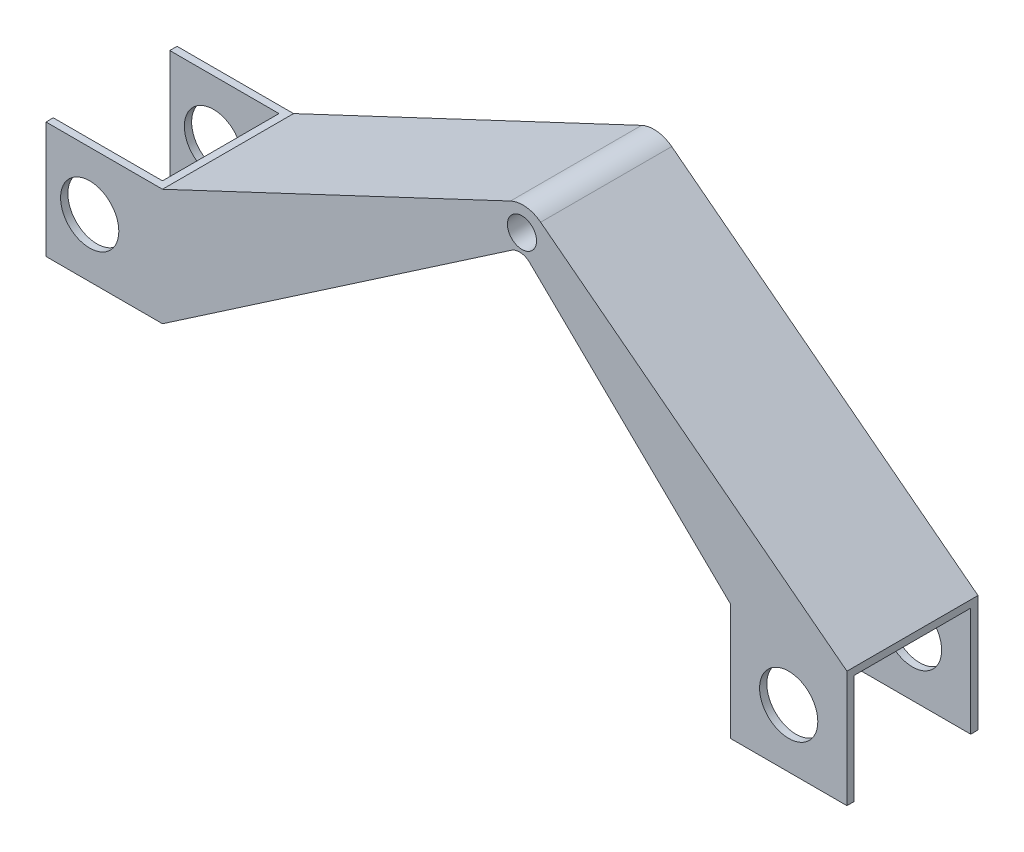
ISO-10303-21;
HEADER;
FILE_DESCRIPTION(('STEP AP214'),'2;1');
FILE_NAME('part.step','',(''),(''),'','','');
FILE_SCHEMA(('AUTOMOTIVE_DESIGN { 1 0 10303 214 1 1 1 1 }'));
ENDSEC;
DATA;
#1=APPLICATION_CONTEXT('core data for automotive mechanical design processes');
#2=APPLICATION_PROTOCOL_DEFINITION('international standard','automotive_design',2000,#1);
#3=PRODUCT_CONTEXT('',#1,'mechanical');
#4=PRODUCT('Part','Part','',(#3));
#5=PRODUCT_RELATED_PRODUCT_CATEGORY('part','',(#4));
#6=PRODUCT_DEFINITION_FORMATION('','',#4);
#7=PRODUCT_DEFINITION_CONTEXT('part definition',#1,'design');
#8=PRODUCT_DEFINITION('design','',#6,#7);
#9=PRODUCT_DEFINITION_SHAPE('','',#8);
#10=(LENGTH_UNIT() NAMED_UNIT(*) SI_UNIT(.MILLI.,.METRE.));
#11=(NAMED_UNIT(*) PLANE_ANGLE_UNIT() SI_UNIT($,.RADIAN.));
#12=(NAMED_UNIT(*) SI_UNIT($,.STERADIAN.) SOLID_ANGLE_UNIT());
#13=UNCERTAINTY_MEASURE_WITH_UNIT(LENGTH_MEASURE(1.E-05),#10,'distance_accuracy_value','');
#14=(GEOMETRIC_REPRESENTATION_CONTEXT(3) GLOBAL_UNCERTAINTY_ASSIGNED_CONTEXT((#13)) GLOBAL_UNIT_ASSIGNED_CONTEXT((#10,
#11,#12)) REPRESENTATION_CONTEXT('',''));
#15=CARTESIAN_POINT('',(0.,0.,0.));
#16=DIRECTION('',(0.,0.,1.));
#17=DIRECTION('',(1.,0.,0.));
#18=AXIS2_PLACEMENT_3D('',#15,#16,#17);
#19=CARTESIAN_POINT('',(1092.2,-232.664807141011,228.6));
#20=DIRECTION('',(0.,1.,0.));
#21=DIRECTION('',(0.,0.,1.));
#22=AXIS2_PLACEMENT_3D('',#19,#20,#21);
#23=PLANE('',#22);
#24=DIRECTION('',(0.,0.,-1.));
#25=VECTOR('',#24,1.);
#26=CARTESIAN_POINT('',(1295.4,-232.664807141011,228.6));
#27=LINE('',#26,#25);
#28=CARTESIAN_POINT('',(1295.4,-232.664807141011,12.7));
#29=VERTEX_POINT('',#28);
#30=CARTESIAN_POINT('',(1295.4,-232.664807141011,0.));
#31=VERTEX_POINT('',#30);
#32=EDGE_CURVE('E252',#29,#31,#27,.T.);
#33=ORIENTED_EDGE('',*,*,#32,.F.);
#34=DIRECTION('',(-1.,0.,0.));
#35=VECTOR('',#34,1.);
#36=CARTESIAN_POINT('',(1092.2,-232.664807141011,12.7));
#37=LINE('',#36,#35);
#38=CARTESIAN_POINT('',(1092.2,-232.664807141011,12.7));
#39=VERTEX_POINT('',#38);
#40=EDGE_CURVE('E183',#29,#39,#37,.T.);
#41=ORIENTED_EDGE('',*,*,#40,.T.);
#42=DIRECTION('',(0.,0.,-1.));
#43=VECTOR('',#42,1.);
#44=CARTESIAN_POINT('',(1092.2,-232.664807141011,228.6));
#45=LINE('',#44,#43);
#46=CARTESIAN_POINT('',(1092.2,-232.664807141011,0.));
#47=VERTEX_POINT('',#46);
#48=EDGE_CURVE('E255',#39,#47,#45,.T.);
#49=ORIENTED_EDGE('',*,*,#48,.T.);
#50=DIRECTION('',(1.,0.,0.));
#51=VECTOR('',#50,1.);
#52=CARTESIAN_POINT('',(1092.2,-232.664807141011,0.));
#53=LINE('',#52,#51);
#54=EDGE_CURVE('E233',#47,#31,#53,.T.);
#55=ORIENTED_EDGE('',*,*,#54,.T.);
#56=EDGE_LOOP('',(#33,#41,#49,#55));
#57=FACE_BOUND('',#56,.T.);
#58=ADVANCED_FACE('F32',(#57),#23,.F.);
#59=CARTESIAN_POINT('',(-101.6,-101.6,228.6));
#60=DIRECTION('',(1.,0.,0.));
#61=DIRECTION('',(0.,0.,-1.));
#62=AXIS2_PLACEMENT_3D('',#59,#60,#61);
#63=PLANE('',#62);
#64=DIRECTION('',(0.,0.,-1.));
#65=VECTOR('',#64,1.);
#66=CARTESIAN_POINT('',(-101.6,-101.6,228.6));
#67=LINE('',#66,#65);
#68=CARTESIAN_POINT('',(-101.6,-101.6,12.7));
#69=VERTEX_POINT('',#68);
#70=CARTESIAN_POINT('',(-101.6,-101.6,0.));
#71=VERTEX_POINT('',#70);
#72=EDGE_CURVE('E311',#69,#71,#67,.T.);
#73=ORIENTED_EDGE('',*,*,#72,.F.);
#74=DIRECTION('',(0.,1.,0.));
#75=VECTOR('',#74,1.);
#76=CARTESIAN_POINT('',(-101.6,-101.6,12.7));
#77=LINE('',#76,#75);
#78=CARTESIAN_POINT('',(-101.6,101.6,12.7));
#79=VERTEX_POINT('',#78);
#80=EDGE_CURVE('E291',#69,#79,#77,.T.);
#81=ORIENTED_EDGE('',*,*,#80,.T.);
#82=DIRECTION('',(0.,0.,-1.));
#83=VECTOR('',#82,1.);
#84=CARTESIAN_POINT('',(-101.6,101.6,228.6));
#85=LINE('',#84,#83);
#86=CARTESIAN_POINT('',(-101.6,101.6,0.));
#87=VERTEX_POINT('',#86);
#88=EDGE_CURVE('E315',#79,#87,#85,.T.);
#89=ORIENTED_EDGE('',*,*,#88,.T.);
#90=DIRECTION('',(0.,-1.,0.));
#91=VECTOR('',#90,1.);
#92=CARTESIAN_POINT('',(-101.6,-101.6,0.));
#93=LINE('',#92,#91);
#94=EDGE_CURVE('E305',#87,#71,#93,.T.);
#95=ORIENTED_EDGE('',*,*,#94,.T.);
#96=EDGE_LOOP('',(#73,#81,#89,#95));
#97=FACE_BOUND('',#96,.T.);
#98=ADVANCED_FACE('F351',(#97),#63,.F.);
#99=CARTESIAN_POINT('',(-101.6,101.6,228.6));
#100=DIRECTION('',(0.,-1.,0.));
#101=DIRECTION('',(0.,0.,-1.));
#102=AXIS2_PLACEMENT_3D('',#99,#100,#101);
#103=PLANE('',#102);
#104=ORIENTED_EDGE('',*,*,#88,.F.);
#105=DIRECTION('',(-1.,0.,0.));
#106=VECTOR('',#105,1.);
#107=CARTESIAN_POINT('',(-88.9,101.6,12.7));
#108=LINE('',#107,#106);
#109=CARTESIAN_POINT('',(88.9,101.6,12.7));
#110=VERTEX_POINT('',#109);
#111=EDGE_CURVE('E283',#110,#79,#108,.T.);
#112=ORIENTED_EDGE('',*,*,#111,.F.);
#113=DIRECTION('',(0.,0.,-1.));
#114=VECTOR('',#113,1.);
#115=CARTESIAN_POINT('',(88.9,101.6,215.9));
#116=LINE('',#115,#114);
#117=CARTESIAN_POINT('',(88.9,101.6,215.9));
#118=VERTEX_POINT('',#117);
#119=EDGE_CURVE('E280',#118,#110,#116,.T.);
#120=ORIENTED_EDGE('',*,*,#119,.F.);
#121=DIRECTION('',(1.,0.,0.));
#122=VECTOR('',#121,1.);
#123=CARTESIAN_POINT('',(-88.9,101.6,215.9));
#124=LINE('',#123,#122);
#125=CARTESIAN_POINT('',(-101.6,101.6,215.9));
#126=VERTEX_POINT('',#125);
#127=EDGE_CURVE('E278',#126,#118,#124,.T.);
#128=ORIENTED_EDGE('',*,*,#127,.F.);
#129=CARTESIAN_POINT('',(-101.6,101.6,228.6));
#130=VERTEX_POINT('',#129);
#131=EDGE_CURVE('E316',#130,#126,#85,.T.);
#132=ORIENTED_EDGE('',*,*,#131,.F.);
#133=DIRECTION('',(-1.,0.,0.));
#134=VECTOR('',#133,1.);
#135=CARTESIAN_POINT('',(-101.6,101.6,228.6));
#136=LINE('',#135,#134);
#137=CARTESIAN_POINT('',(101.6,101.6,228.6));
#138=VERTEX_POINT('',#137);
#139=EDGE_CURVE('E295',#138,#130,#136,.T.);
#140=ORIENTED_EDGE('',*,*,#139,.F.);
#141=DIRECTION('',(0.,0.,-1.));
#142=VECTOR('',#141,1.);
#143=CARTESIAN_POINT('',(101.6,101.6,228.6));
#144=LINE('',#143,#142);
#145=CARTESIAN_POINT('',(101.6,101.6,0.));
#146=VERTEX_POINT('',#145);
#147=EDGE_CURVE('E319',#138,#146,#144,.T.);
#148=ORIENTED_EDGE('',*,*,#147,.T.);
#149=DIRECTION('',(-1.,0.,0.));
#150=VECTOR('',#149,1.);
#151=CARTESIAN_POINT('',(-101.6,101.6,0.));
#152=LINE('',#151,#150);
#153=EDGE_CURVE('E294',#146,#87,#152,.T.);
#154=ORIENTED_EDGE('',*,*,#153,.T.);
#155=EDGE_LOOP('',(#104,#112,#120,#128,#132,#140,#148,#154));
#156=FACE_BOUND('',#155,.T.);
#157=ADVANCED_FACE('F34',(#156),#103,.F.);
#158=ORIENTED_EDGE('',*,*,#131,.T.);
#159=DIRECTION('',(0.,-1.,0.));
#160=VECTOR('',#159,1.);
#161=CARTESIAN_POINT('',(-101.6,-101.6,215.9));
#162=LINE('',#161,#160);
#163=CARTESIAN_POINT('',(-101.6,-101.6,215.9));
#164=VERTEX_POINT('',#163);
#165=EDGE_CURVE('E287',#126,#164,#162,.T.);
#166=ORIENTED_EDGE('',*,*,#165,.T.);
#167=CARTESIAN_POINT('',(-101.6,-101.6,228.6));
#168=VERTEX_POINT('',#167);
#169=EDGE_CURVE('E312',#168,#164,#67,.T.);
#170=ORIENTED_EDGE('',*,*,#169,.F.);
#171=DIRECTION('',(0.,-1.,0.));
#172=VECTOR('',#171,1.);
#173=CARTESIAN_POINT('',(-101.6,-101.6,228.6));
#174=LINE('',#173,#172);
#175=EDGE_CURVE('E297',#130,#168,#174,.T.);
#176=ORIENTED_EDGE('',*,*,#175,.F.);
#177=EDGE_LOOP('',(#158,#166,#170,#176));
#178=FACE_BOUND('',#177,.T.);
#179=ADVANCED_FACE('F359',(#178),#63,.F.);
#180=CARTESIAN_POINT('',(-101.6,-101.6,228.6));
#181=DIRECTION('',(0.,1.,0.));
#182=DIRECTION('',(0.,0.,1.));
#183=AXIS2_PLACEMENT_3D('',#180,#181,#182);
#184=PLANE('',#183);
#185=DIRECTION('',(0.,0.,-1.));
#186=VECTOR('',#185,1.);
#187=CARTESIAN_POINT('',(88.9,-101.6,228.6));
#188=LINE('',#187,#186);
#189=CARTESIAN_POINT('',(88.9,-101.6,215.9));
#190=VERTEX_POINT('',#189);
#191=CARTESIAN_POINT('',(88.9,-101.6,12.7));
#192=VERTEX_POINT('',#191);
#193=EDGE_CURVE('E325',#190,#192,#188,.T.);
#194=ORIENTED_EDGE('',*,*,#193,.T.);
#195=DIRECTION('',(-1.,0.,0.));
#196=VECTOR('',#195,1.);
#197=CARTESIAN_POINT('',(-101.6,-101.6,12.7));
#198=LINE('',#197,#196);
#199=EDGE_CURVE('E41',#192,#69,#198,.T.);
#200=ORIENTED_EDGE('',*,*,#199,.T.);
#201=ORIENTED_EDGE('',*,*,#72,.T.);
#202=DIRECTION('',(1.,0.,0.));
#203=VECTOR('',#202,1.);
#204=CARTESIAN_POINT('',(-101.6,-101.6,0.));
#205=LINE('',#204,#203);
#206=CARTESIAN_POINT('',(101.6,-101.6,0.));
#207=VERTEX_POINT('',#206);
#208=EDGE_CURVE('E298',#71,#207,#205,.T.);
#209=ORIENTED_EDGE('',*,*,#208,.T.);
#210=DIRECTION('',(0.,0.,-1.));
#211=VECTOR('',#210,1.);
#212=CARTESIAN_POINT('',(101.6,-101.6,228.6));
#213=LINE('',#212,#211);
#214=CARTESIAN_POINT('',(101.6,-101.6,228.6));
#215=VERTEX_POINT('',#214);
#216=EDGE_CURVE('E302',#215,#207,#213,.T.);
#217=ORIENTED_EDGE('',*,*,#216,.F.);
#218=DIRECTION('',(1.,0.,0.));
#219=VECTOR('',#218,1.);
#220=CARTESIAN_POINT('',(-101.6,-101.6,228.6));
#221=LINE('',#220,#219);
#222=EDGE_CURVE('E300',#168,#215,#221,.T.);
#223=ORIENTED_EDGE('',*,*,#222,.F.);
#224=ORIENTED_EDGE('',*,*,#169,.T.);
#225=DIRECTION('',(1.,0.,0.));
#226=VECTOR('',#225,1.);
#227=CARTESIAN_POINT('',(-101.6,-101.6,215.9));
#228=LINE('',#227,#226);
#229=EDGE_CURVE('E322',#164,#190,#228,.T.);
#230=ORIENTED_EDGE('',*,*,#229,.T.);
#231=EDGE_LOOP('',(#194,#200,#201,#209,#217,#223,#224,#230));
#232=FACE_BOUND('',#231,.T.);
#233=ADVANCED_FACE('F442',(#232),#184,.F.);
#234=CARTESIAN_POINT('',(0.,0.,228.6));
#235=DIRECTION('',(0.,0.,-1.));
#236=DIRECTION('',(-1.,0.,0.));
#237=AXIS2_PLACEMENT_3D('',#234,#235,#236);
#238=PLANE('',#237);
#239=CARTESIAN_POINT('',(728.615646144925,349.569241459153,228.6));
#240=DIRECTION('',(0.,0.,1.));
#241=DIRECTION('',(1.,0.,0.));
#242=AXIS2_PLACEMENT_3D('',#239,#240,#241);
#243=CIRCLE('',#242,25.4);
#244=CARTESIAN_POINT('',(754.015646144925,349.569241459153,228.6));
#245=VERTEX_POINT('',#244);
#246=EDGE_CURVE('E621',#245,#245,#243,.T.);
#247=ORIENTED_EDGE('',*,*,#246,.F.);
#248=EDGE_LOOP('',(#247));
#249=FACE_BOUND('',#248,.T.);
#250=CARTESIAN_POINT('',(1193.8,-131.064807141011,228.6));
#251=DIRECTION('',(0.,0.,1.));
#252=DIRECTION('',(1.,0.,0.));
#253=AXIS2_PLACEMENT_3D('',#250,#251,#252);
#254=CIRCLE('',#253,50.8);
#255=CARTESIAN_POINT('',(1244.6,-131.064807141011,228.6));
#256=VERTEX_POINT('',#255);
#257=EDGE_CURVE('E623',#256,#256,#254,.T.);
#258=ORIENTED_EDGE('',*,*,#257,.F.);
#259=EDGE_LOOP('',(#258));
#260=FACE_BOUND('',#259,.T.);
#261=CARTESIAN_POINT('',(-25.4,0.,228.6));
#262=DIRECTION('',(0.,0.,1.));
#263=DIRECTION('',(1.,0.,0.));
#264=AXIS2_PLACEMENT_3D('',#261,#262,#263);
#265=CIRCLE('',#264,50.8);
#266=CARTESIAN_POINT('',(25.4,0.,228.6));
#267=VERTEX_POINT('',#266);
#268=EDGE_CURVE('E268',#267,#267,#265,.T.);
#269=ORIENTED_EDGE('',*,*,#268,.F.);
#270=EDGE_LOOP('',(#269));
#271=FACE_BOUND('',#270,.T.);
#272=ORIENTED_EDGE('',*,*,#222,.T.);
#273=DIRECTION('',(0.825979060801124,0.563700799288145,0.));
#274=VECTOR('',#273,1.);
#275=CARTESIAN_POINT('',(101.6,-101.6,228.6));
#276=LINE('',#275,#274);
#277=CARTESIAN_POINT('',(710.108636303215,313.68510943748,228.6));
#278=VERTEX_POINT('',#277);
#279=EDGE_CURVE('E204',#215,#278,#276,.T.);
#280=ORIENTED_EDGE('',*,*,#279,.T.);
#281=CARTESIAN_POINT('',(724.426636605134,292.705241293131,228.6));
#282=DIRECTION('',(0.,0.,-1.));
#283=DIRECTION('',(-1.,0.,0.));
#284=AXIS2_PLACEMENT_3D('',#281,#282,#283);
#285=CIRCLE('',#284,25.4);
#286=CARTESIAN_POINT('',(742.133450582767,310.915917797905,228.6));
#287=VERTEX_POINT('',#286);
#288=EDGE_CURVE('E206',#278,#287,#285,.T.);
#289=ORIENTED_EDGE('',*,*,#288,.T.);
#290=DIRECTION('',(0.716955767904459,-0.697118660536732,0.));
#291=VECTOR('',#290,1.);
#292=CARTESIAN_POINT('',(742.133450582767,310.915917797905,228.6));
#293=LINE('',#292,#291);
#294=CARTESIAN_POINT('',(1092.2,-29.4648071410109,228.6));
#295=VERTEX_POINT('',#294);
#296=EDGE_CURVE('E209',#287,#295,#293,.T.);
#297=ORIENTED_EDGE('',*,*,#296,.T.);
#298=DIRECTION('',(0.,-1.,0.));
#299=VECTOR('',#298,1.);
#300=CARTESIAN_POINT('',(1092.2,-29.4648071410109,228.6));
#301=LINE('',#300,#299);
#302=CARTESIAN_POINT('',(1092.2,-232.664807141011,228.6));
#303=VERTEX_POINT('',#302);
#304=EDGE_CURVE('E211',#295,#303,#301,.T.);
#305=ORIENTED_EDGE('',*,*,#304,.T.);
#306=DIRECTION('',(1.,0.,0.));
#307=VECTOR('',#306,1.);
#308=CARTESIAN_POINT('',(1092.2,-232.664807141011,228.6));
#309=LINE('',#308,#307);
#310=CARTESIAN_POINT('',(1295.4,-232.664807141011,228.6));
#311=VERTEX_POINT('',#310);
#312=EDGE_CURVE('E213',#303,#311,#309,.T.);
#313=ORIENTED_EDGE('',*,*,#312,.T.);
#314=DIRECTION('',(0.,1.,0.));
#315=VECTOR('',#314,1.);
#316=CARTESIAN_POINT('',(1295.4,-232.664807141011,228.6));
#317=LINE('',#316,#315);
#318=CARTESIAN_POINT('',(1295.4,-29.4648071410109,228.6));
#319=VERTEX_POINT('',#318);
#320=EDGE_CURVE('E215',#311,#319,#317,.T.);
#321=ORIENTED_EDGE('',*,*,#320,.T.);
#322=DIRECTION('',(-0.792554656782893,0.609800882265475,0.));
#323=VECTOR('',#322,1.);
#324=CARTESIAN_POINT('',(761.166531665849,381.580711975977,228.6));
#325=LINE('',#324,#323);
#326=CARTESIAN_POINT('',(761.166531665849,381.580711975977,228.6));
#327=VERTEX_POINT('',#326);
#328=EDGE_CURVE('E217',#319,#327,#325,.T.);
#329=ORIENTED_EDGE('',*,*,#328,.T.);
#330=CARTESIAN_POINT('',(730.188646846763,341.318935411406,228.6));
#331=DIRECTION('',(0.,0.,1.));
#332=DIRECTION('',(-1.,0.,0.));
#333=AXIS2_PLACEMENT_3D('',#330,#331,#332);
#334=CIRCLE('',#333,50.7999999999999);
#335=CARTESIAN_POINT('',(708.554663442672,387.282081105228,228.6));
#336=VERTEX_POINT('',#335);
#337=EDGE_CURVE('E219',#327,#336,#334,.T.);
#338=ORIENTED_EDGE('',*,*,#337,.T.);
#339=DIRECTION('',(-0.904786332555559,-0.425865815041148,0.));
#340=VECTOR('',#339,1.);
#341=CARTESIAN_POINT('',(101.6,101.6,228.6));
#342=LINE('',#341,#340);
#343=EDGE_CURVE('E221',#336,#138,#342,.T.);
#344=ORIENTED_EDGE('',*,*,#343,.T.);
#345=ORIENTED_EDGE('',*,*,#139,.T.);
#346=ORIENTED_EDGE('',*,*,#175,.T.);
#347=EDGE_LOOP('',(#272,#280,#289,#297,#305,#313,#321,#329,#338,#344,#345,#346));
#348=FACE_BOUND('',#347,.T.);
#349=ADVANCED_FACE('F420',(#249,#260,#271,#348),#238,.F.);
#350=CARTESIAN_POINT('',(0.,0.,0.));
#351=DIRECTION('',(0.,0.,-1.));
#352=DIRECTION('',(-1.,0.,0.));
#353=AXIS2_PLACEMENT_3D('',#350,#351,#352);
#354=PLANE('',#353);
#355=CARTESIAN_POINT('',(728.615646144925,349.569241459153,0.));
#356=DIRECTION('',(0.,0.,1.));
#357=DIRECTION('',(1.,0.,0.));
#358=AXIS2_PLACEMENT_3D('',#355,#356,#357);
#359=CIRCLE('',#358,25.4);
#360=CARTESIAN_POINT('',(754.015646144925,349.569241459153,0.));
#361=VERTEX_POINT('',#360);
#362=EDGE_CURVE('E618',#361,#361,#359,.T.);
#363=ORIENTED_EDGE('',*,*,#362,.T.);
#364=EDGE_LOOP('',(#363));
#365=FACE_BOUND('',#364,.T.);
#366=CARTESIAN_POINT('',(1193.8,-131.064807141011,0.));
#367=DIRECTION('',(0.,0.,1.));
#368=DIRECTION('',(1.,0.,0.));
#369=AXIS2_PLACEMENT_3D('',#366,#367,#368);
#370=CIRCLE('',#369,50.8);
#371=CARTESIAN_POINT('',(1244.6,-131.064807141011,0.));
#372=VERTEX_POINT('',#371);
#373=EDGE_CURVE('E626',#372,#372,#370,.T.);
#374=ORIENTED_EDGE('',*,*,#373,.T.);
#375=EDGE_LOOP('',(#374));
#376=FACE_BOUND('',#375,.T.);
#377=CARTESIAN_POINT('',(-25.4,0.,0.));
#378=DIRECTION('',(0.,0.,1.));
#379=DIRECTION('',(1.,0.,0.));
#380=AXIS2_PLACEMENT_3D('',#377,#378,#379);
#381=CIRCLE('',#380,50.8);
#382=CARTESIAN_POINT('',(25.4,0.,0.));
#383=VERTEX_POINT('',#382);
#384=EDGE_CURVE('E269',#383,#383,#381,.T.);
#385=ORIENTED_EDGE('',*,*,#384,.T.);
#386=EDGE_LOOP('',(#385));
#387=FACE_BOUND('',#386,.T.);
#388=ORIENTED_EDGE('',*,*,#153,.F.);
#389=DIRECTION('',(-0.904786332555559,-0.425865815041148,0.));
#390=VECTOR('',#389,1.);
#391=CARTESIAN_POINT('',(101.6,101.6,0.));
#392=LINE('',#391,#390);
#393=CARTESIAN_POINT('',(708.554663442672,387.282081105228,0.));
#394=VERTEX_POINT('',#393);
#395=EDGE_CURVE('E207',#394,#146,#392,.T.);
#396=ORIENTED_EDGE('',*,*,#395,.F.);
#397=CARTESIAN_POINT('',(730.188646846763,341.318935411406,0.));
#398=DIRECTION('',(0.,0.,1.));
#399=DIRECTION('',(-1.,0.,0.));
#400=AXIS2_PLACEMENT_3D('',#397,#398,#399);
#401=CIRCLE('',#400,50.7999999999999);
#402=CARTESIAN_POINT('',(761.166531665849,381.580711975977,0.));
#403=VERTEX_POINT('',#402);
#404=EDGE_CURVE('E240',#403,#394,#401,.T.);
#405=ORIENTED_EDGE('',*,*,#404,.F.);
#406=DIRECTION('',(-0.792554656782893,0.609800882265475,0.));
#407=VECTOR('',#406,1.);
#408=CARTESIAN_POINT('',(761.166531665849,381.580711975977,0.));
#409=LINE('',#408,#407);
#410=CARTESIAN_POINT('',(1295.4,-29.4648071410109,0.));
#411=VERTEX_POINT('',#410);
#412=EDGE_CURVE('E238',#411,#403,#409,.T.);
#413=ORIENTED_EDGE('',*,*,#412,.F.);
#414=DIRECTION('',(0.,1.,0.));
#415=VECTOR('',#414,1.);
#416=CARTESIAN_POINT('',(1295.4,-232.664807141011,0.));
#417=LINE('',#416,#415);
#418=EDGE_CURVE('E236',#31,#411,#417,.T.);
#419=ORIENTED_EDGE('',*,*,#418,.F.);
#420=ORIENTED_EDGE('',*,*,#54,.F.);
#421=DIRECTION('',(0.,-1.,0.));
#422=VECTOR('',#421,1.);
#423=CARTESIAN_POINT('',(1092.2,-29.4648071410109,0.));
#424=LINE('',#423,#422);
#425=CARTESIAN_POINT('',(1092.2,-29.4648071410109,0.));
#426=VERTEX_POINT('',#425);
#427=EDGE_CURVE('E230',#426,#47,#424,.T.);
#428=ORIENTED_EDGE('',*,*,#427,.F.);
#429=DIRECTION('',(0.716955767904459,-0.697118660536732,0.));
#430=VECTOR('',#429,1.);
#431=CARTESIAN_POINT('',(742.133450582767,310.915917797905,0.));
#432=LINE('',#431,#430);
#433=CARTESIAN_POINT('',(742.133450582767,310.915917797905,0.));
#434=VERTEX_POINT('',#433);
#435=EDGE_CURVE('E228',#434,#426,#432,.T.);
#436=ORIENTED_EDGE('',*,*,#435,.F.);
#437=CARTESIAN_POINT('',(724.426636605134,292.705241293131,0.));
#438=DIRECTION('',(0.,0.,-1.));
#439=DIRECTION('',(-1.,0.,0.));
#440=AXIS2_PLACEMENT_3D('',#437,#438,#439);
#441=CIRCLE('',#440,25.4);
#442=CARTESIAN_POINT('',(710.108636303215,313.68510943748,0.));
#443=VERTEX_POINT('',#442);
#444=EDGE_CURVE('E226',#443,#434,#441,.T.);
#445=ORIENTED_EDGE('',*,*,#444,.F.);
#446=DIRECTION('',(0.825979060801124,0.563700799288145,0.));
#447=VECTOR('',#446,1.);
#448=CARTESIAN_POINT('',(101.6,-101.6,0.));
#449=LINE('',#448,#447);
#450=EDGE_CURVE('E203',#207,#443,#449,.T.);
#451=ORIENTED_EDGE('',*,*,#450,.F.);
#452=ORIENTED_EDGE('',*,*,#208,.F.);
#453=ORIENTED_EDGE('',*,*,#94,.F.);
#454=EDGE_LOOP('',(#388,#396,#405,#413,#419,#420,#428,#436,#445,#451,#452,#453));
#455=FACE_BOUND('',#454,.T.);
#456=ADVANCED_FACE('F415',(#365,#376,#387,#455),#354,.T.);
#457=CARTESIAN_POINT('',(-88.9,-127.,12.7));
#458=DIRECTION('',(0.,0.,-1.));
#459=DIRECTION('',(-1.,0.,0.));
#460=AXIS2_PLACEMENT_3D('',#457,#458,#459);
#461=PLANE('',#460);
#462=CARTESIAN_POINT('',(-25.4,0.,12.7));
#463=DIRECTION('',(0.,0.,-1.));
#464=DIRECTION('',(-1.,0.,0.));
#465=AXIS2_PLACEMENT_3D('',#462,#463,#464);
#466=CIRCLE('',#465,50.8);
#467=CARTESIAN_POINT('',(-76.2,0.,12.7));
#468=VERTEX_POINT('',#467);
#469=EDGE_CURVE('E275',#468,#468,#466,.T.);
#470=ORIENTED_EDGE('',*,*,#469,.T.);
#471=EDGE_LOOP('',(#470));
#472=FACE_BOUND('',#471,.T.);
#473=ORIENTED_EDGE('',*,*,#199,.F.);
#474=DIRECTION('',(0.,1.,0.));
#475=VECTOR('',#474,1.);
#476=CARTESIAN_POINT('',(88.9,-127.,12.7));
#477=LINE('',#476,#475);
#478=EDGE_CURVE('E285',#192,#110,#477,.T.);
#479=ORIENTED_EDGE('',*,*,#478,.T.);
#480=ORIENTED_EDGE('',*,*,#111,.T.);
#481=ORIENTED_EDGE('',*,*,#80,.F.);
#482=EDGE_LOOP('',(#473,#479,#480,#481));
#483=FACE_BOUND('',#482,.T.);
#484=ADVANCED_FACE('F455',(#472,#483),#461,.F.);
#485=CARTESIAN_POINT('',(88.9,-127.,215.9));
#486=DIRECTION('',(1.,0.,0.));
#487=DIRECTION('',(0.,0.,-1.));
#488=AXIS2_PLACEMENT_3D('',#485,#486,#487);
#489=PLANE('',#488);
#490=DIRECTION('',(0.,1.,0.));
#491=VECTOR('',#490,1.);
#492=CARTESIAN_POINT('',(88.9,-127.,215.9));
#493=LINE('',#492,#491);
#494=EDGE_CURVE('E56',#190,#118,#493,.T.);
#495=ORIENTED_EDGE('',*,*,#494,.T.);
#496=ORIENTED_EDGE('',*,*,#119,.T.);
#497=ORIENTED_EDGE('',*,*,#478,.F.);
#498=ORIENTED_EDGE('',*,*,#193,.F.);
#499=EDGE_LOOP('',(#495,#496,#497,#498));
#500=FACE_BOUND('',#499,.T.);
#501=ADVANCED_FACE('F346',(#500),#489,.F.);
#502=CARTESIAN_POINT('',(-88.9,-127.,215.9));
#503=DIRECTION('',(0.,0.,1.));
#504=DIRECTION('',(1.,0.,0.));
#505=AXIS2_PLACEMENT_3D('',#502,#503,#504);
#506=PLANE('',#505);
#507=CARTESIAN_POINT('',(-25.4,0.,215.9));
#508=DIRECTION('',(0.,0.,1.));
#509=DIRECTION('',(1.,0.,0.));
#510=AXIS2_PLACEMENT_3D('',#507,#508,#509);
#511=CIRCLE('',#510,50.8);
#512=CARTESIAN_POINT('',(25.4,0.,215.9));
#513=VERTEX_POINT('',#512);
#514=EDGE_CURVE('E272',#513,#513,#511,.T.);
#515=ORIENTED_EDGE('',*,*,#514,.T.);
#516=EDGE_LOOP('',(#515));
#517=FACE_BOUND('',#516,.T.);
#518=ORIENTED_EDGE('',*,*,#127,.T.);
#519=ORIENTED_EDGE('',*,*,#494,.F.);
#520=ORIENTED_EDGE('',*,*,#229,.F.);
#521=ORIENTED_EDGE('',*,*,#165,.F.);
#522=EDGE_LOOP('',(#518,#519,#520,#521));
#523=FACE_BOUND('',#522,.T.);
#524=ADVANCED_FACE('F333',(#517,#523),#506,.F.);
#525=CARTESIAN_POINT('',(-25.4,0.,0.));
#526=DIRECTION('',(0.,0.,1.));
#527=DIRECTION('',(1.,0.,0.));
#528=AXIS2_PLACEMENT_3D('',#525,#526,#527);
#529=CYLINDRICAL_SURFACE('',#528,50.8);
#530=ORIENTED_EDGE('',*,*,#268,.T.);
#531=EDGE_LOOP('',(#530));
#532=FACE_BOUND('',#531,.T.);
#533=ORIENTED_EDGE('',*,*,#514,.F.);
#534=EDGE_LOOP('',(#533));
#535=FACE_BOUND('',#534,.T.);
#536=ADVANCED_FACE('F335',(#532,#535),#529,.F.);
#537=ORIENTED_EDGE('',*,*,#384,.F.);
#538=EDGE_LOOP('',(#537));
#539=FACE_BOUND('',#538,.T.);
#540=ORIENTED_EDGE('',*,*,#469,.F.);
#541=EDGE_LOOP('',(#540));
#542=FACE_BOUND('',#541,.T.);
#543=ADVANCED_FACE('F337',(#539,#542),#529,.F.);
#544=CARTESIAN_POINT('',(101.6,-101.6,228.6));
#545=DIRECTION('',(-0.563700799288145,0.825979060801124,0.));
#546=DIRECTION('',(-0.825979060801124,-0.563700799288145,0.));
#547=AXIS2_PLACEMENT_3D('',#544,#545,#546);
#548=PLANE('',#547);
#549=ORIENTED_EDGE('',*,*,#450,.T.);
#550=DIRECTION('',(0.,0.,-1.));
#551=VECTOR('',#550,1.);
#552=CARTESIAN_POINT('',(710.108636303215,313.68510943748,228.6));
#553=LINE('',#552,#551);
#554=EDGE_CURVE('E265',#278,#443,#553,.T.);
#555=ORIENTED_EDGE('',*,*,#554,.F.);
#556=ORIENTED_EDGE('',*,*,#279,.F.);
#557=ORIENTED_EDGE('',*,*,#216,.T.);
#558=EDGE_LOOP('',(#549,#555,#556,#557));
#559=FACE_BOUND('',#558,.T.);
#560=ADVANCED_FACE('F344',(#559),#548,.F.);
#561=CARTESIAN_POINT('',(724.426636605134,292.705241293131,228.6));
#562=DIRECTION('',(0.,0.,-1.));
#563=DIRECTION('',(-1.,0.,0.));
#564=AXIS2_PLACEMENT_3D('',#561,#562,#563);
#565=CYLINDRICAL_SURFACE('',#564,25.4);
#566=ORIENTED_EDGE('',*,*,#444,.T.);
#567=DIRECTION('',(0.,0.,-1.));
#568=VECTOR('',#567,1.);
#569=CARTESIAN_POINT('',(742.133450582767,310.915917797905,228.6));
#570=LINE('',#569,#568);
#571=EDGE_CURVE('E262',#287,#434,#570,.T.);
#572=ORIENTED_EDGE('',*,*,#571,.F.);
#573=ORIENTED_EDGE('',*,*,#288,.F.);
#574=ORIENTED_EDGE('',*,*,#554,.T.);
#575=EDGE_LOOP('',(#566,#572,#573,#574));
#576=FACE_BOUND('',#575,.T.);
#577=ADVANCED_FACE('F434',(#576),#565,.F.);
#578=CARTESIAN_POINT('',(742.133450582767,310.915917797905,228.6));
#579=DIRECTION('',(0.697118660536732,0.716955767904459,0.));
#580=DIRECTION('',(-0.716955767904459,0.697118660536732,0.));
#581=AXIS2_PLACEMENT_3D('',#578,#579,#580);
#582=PLANE('',#581);
#583=ORIENTED_EDGE('',*,*,#435,.T.);
#584=DIRECTION('',(0.,0.,-1.));
#585=VECTOR('',#584,1.);
#586=CARTESIAN_POINT('',(1092.2,-29.4648071410109,228.6));
#587=LINE('',#586,#585);
#588=EDGE_CURVE('E259',#295,#426,#587,.T.);
#589=ORIENTED_EDGE('',*,*,#588,.F.);
#590=ORIENTED_EDGE('',*,*,#296,.F.);
#591=ORIENTED_EDGE('',*,*,#571,.T.);
#592=EDGE_LOOP('',(#583,#589,#590,#591));
#593=FACE_BOUND('',#592,.T.);
#594=ADVANCED_FACE('F370',(#593),#582,.F.);
#595=CARTESIAN_POINT('',(1092.2,-29.4648071410109,228.6));
#596=DIRECTION('',(1.,0.,0.));
#597=DIRECTION('',(0.,0.,-1.));
#598=AXIS2_PLACEMENT_3D('',#595,#596,#597);
#599=PLANE('',#598);
#600=ORIENTED_EDGE('',*,*,#48,.F.);
#601=DIRECTION('',(0.,-1.,0.));
#602=VECTOR('',#601,1.);
#603=CARTESIAN_POINT('',(1092.2,-219.964807141011,12.7));
#604=LINE('',#603,#602);
#605=CARTESIAN_POINT('',(1092.2,-42.1648071410109,12.7));
#606=VERTEX_POINT('',#605);
#607=EDGE_CURVE('E189',#606,#39,#604,.T.);
#608=ORIENTED_EDGE('',*,*,#607,.F.);
#609=DIRECTION('',(0.,0.,-1.));
#610=VECTOR('',#609,1.);
#611=CARTESIAN_POINT('',(1092.2,-42.1648071410109,215.9));
#612=LINE('',#611,#610);
#613=CARTESIAN_POINT('',(1092.2,-42.1648071410109,215.9));
#614=VERTEX_POINT('',#613);
#615=EDGE_CURVE('E173',#614,#606,#612,.T.);
#616=ORIENTED_EDGE('',*,*,#615,.F.);
#617=DIRECTION('',(0.,1.,0.));
#618=VECTOR('',#617,1.);
#619=CARTESIAN_POINT('',(1092.2,-219.964807141011,215.9));
#620=LINE('',#619,#618);
#621=CARTESIAN_POINT('',(1092.2,-232.664807141011,215.9));
#622=VERTEX_POINT('',#621);
#623=EDGE_CURVE('E196',#622,#614,#620,.T.);
#624=ORIENTED_EDGE('',*,*,#623,.F.);
#625=EDGE_CURVE('E256',#303,#622,#45,.T.);
#626=ORIENTED_EDGE('',*,*,#625,.F.);
#627=ORIENTED_EDGE('',*,*,#304,.F.);
#628=ORIENTED_EDGE('',*,*,#588,.T.);
#629=ORIENTED_EDGE('',*,*,#427,.T.);
#630=EDGE_LOOP('',(#600,#608,#616,#624,#626,#627,#628,#629));
#631=FACE_BOUND('',#630,.T.);
#632=ADVANCED_FACE('F363',(#631),#599,.F.);
#633=ORIENTED_EDGE('',*,*,#625,.T.);
#634=DIRECTION('',(1.,0.,0.));
#635=VECTOR('',#634,1.);
#636=CARTESIAN_POINT('',(1092.2,-232.664807141011,215.9));
#637=LINE('',#636,#635);
#638=CARTESIAN_POINT('',(1295.4,-232.664807141011,215.9));
#639=VERTEX_POINT('',#638);
#640=EDGE_CURVE('E176',#622,#639,#637,.T.);
#641=ORIENTED_EDGE('',*,*,#640,.T.);
#642=EDGE_CURVE('E253',#311,#639,#27,.T.);
#643=ORIENTED_EDGE('',*,*,#642,.F.);
#644=ORIENTED_EDGE('',*,*,#312,.F.);
#645=EDGE_LOOP('',(#633,#641,#643,#644));
#646=FACE_BOUND('',#645,.T.);
#647=ADVANCED_FACE('F354',(#646),#23,.F.);
#648=CARTESIAN_POINT('',(1295.4,-232.664807141011,228.6));
#649=DIRECTION('',(-1.,0.,0.));
#650=DIRECTION('',(0.,0.,1.));
#651=AXIS2_PLACEMENT_3D('',#648,#649,#650);
#652=PLANE('',#651);
#653=DIRECTION('',(0.,0.,-1.));
#654=VECTOR('',#653,1.);
#655=CARTESIAN_POINT('',(1295.4,-42.1648071410109,215.9));
#656=LINE('',#655,#654);
#657=CARTESIAN_POINT('',(1295.4,-42.1648071410109,215.9));
#658=VERTEX_POINT('',#657);
#659=CARTESIAN_POINT('',(1295.4,-42.1648071410109,12.7));
#660=VERTEX_POINT('',#659);
#661=EDGE_CURVE('E48',#658,#660,#656,.T.);
#662=ORIENTED_EDGE('',*,*,#661,.T.);
#663=DIRECTION('',(0.,-1.,0.));
#664=VECTOR('',#663,1.);
#665=CARTESIAN_POINT('',(1295.4,-42.1648071410109,12.7));
#666=LINE('',#665,#664);
#667=EDGE_CURVE('E180',#660,#29,#666,.T.);
#668=ORIENTED_EDGE('',*,*,#667,.T.);
#669=ORIENTED_EDGE('',*,*,#32,.T.);
#670=ORIENTED_EDGE('',*,*,#418,.T.);
#671=DIRECTION('',(0.,0.,-1.));
#672=VECTOR('',#671,1.);
#673=CARTESIAN_POINT('',(1295.4,-29.4648071410109,228.6));
#674=LINE('',#673,#672);
#675=EDGE_CURVE('E249',#319,#411,#674,.T.);
#676=ORIENTED_EDGE('',*,*,#675,.F.);
#677=ORIENTED_EDGE('',*,*,#320,.F.);
#678=ORIENTED_EDGE('',*,*,#642,.T.);
#679=DIRECTION('',(0.,1.,0.));
#680=VECTOR('',#679,1.);
#681=CARTESIAN_POINT('',(1295.4,-232.664807141011,215.9));
#682=LINE('',#681,#680);
#683=EDGE_CURVE('E11',#639,#658,#682,.T.);
#684=ORIENTED_EDGE('',*,*,#683,.T.);
#685=EDGE_LOOP('',(#662,#668,#669,#670,#676,#677,#678,#684));
#686=FACE_BOUND('',#685,.T.);
#687=ADVANCED_FACE('F187',(#686),#652,.F.);
#688=CARTESIAN_POINT('',(761.166531665849,381.580711975977,228.6));
#689=DIRECTION('',(-0.609800882265475,-0.792554656782893,0.));
#690=DIRECTION('',(0.792554656782893,-0.609800882265475,0.));
#691=AXIS2_PLACEMENT_3D('',#688,#689,#690);
#692=PLANE('',#691);
#693=ORIENTED_EDGE('',*,*,#412,.T.);
#694=DIRECTION('',(0.,0.,-1.));
#695=VECTOR('',#694,1.);
#696=CARTESIAN_POINT('',(761.166531665849,381.580711975977,228.6));
#697=LINE('',#696,#695);
#698=EDGE_CURVE('E246',#327,#403,#697,.T.);
#699=ORIENTED_EDGE('',*,*,#698,.F.);
#700=ORIENTED_EDGE('',*,*,#328,.F.);
#701=ORIENTED_EDGE('',*,*,#675,.T.);
#702=EDGE_LOOP('',(#693,#699,#700,#701));
#703=FACE_BOUND('',#702,.T.);
#704=ADVANCED_FACE('F369',(#703),#692,.F.);
#705=CARTESIAN_POINT('',(730.188646846763,341.318935411406,228.6));
#706=DIRECTION('',(0.,0.,-1.));
#707=DIRECTION('',(-1.,0.,0.));
#708=AXIS2_PLACEMENT_3D('',#705,#706,#707);
#709=CYLINDRICAL_SURFACE('',#708,50.7999999999999);
#710=ORIENTED_EDGE('',*,*,#404,.T.);
#711=DIRECTION('',(0.,0.,-1.));
#712=VECTOR('',#711,1.);
#713=CARTESIAN_POINT('',(708.554663442672,387.282081105228,228.6));
#714=LINE('',#713,#712);
#715=EDGE_CURVE('E224',#336,#394,#714,.T.);
#716=ORIENTED_EDGE('',*,*,#715,.F.);
#717=ORIENTED_EDGE('',*,*,#337,.F.);
#718=ORIENTED_EDGE('',*,*,#698,.T.);
#719=EDGE_LOOP('',(#710,#716,#717,#718));
#720=FACE_BOUND('',#719,.T.);
#721=ADVANCED_FACE('F396',(#720),#709,.T.);
#722=CARTESIAN_POINT('',(101.6,101.6,228.6));
#723=DIRECTION('',(0.425865815041148,-0.904786332555559,0.));
#724=DIRECTION('',(0.904786332555559,0.425865815041148,0.));
#725=AXIS2_PLACEMENT_3D('',#722,#723,#724);
#726=PLANE('',#725);
#727=ORIENTED_EDGE('',*,*,#395,.T.);
#728=ORIENTED_EDGE('',*,*,#147,.F.);
#729=ORIENTED_EDGE('',*,*,#343,.F.);
#730=ORIENTED_EDGE('',*,*,#715,.T.);
#731=EDGE_LOOP('',(#727,#728,#729,#730));
#732=FACE_BOUND('',#731,.T.);
#733=ADVANCED_FACE('F389',(#732),#726,.F.);
#734=CARTESIAN_POINT('',(1295.4,-219.964807141011,12.7));
#735=DIRECTION('',(0.,0.,-1.));
#736=DIRECTION('',(-1.,0.,0.));
#737=AXIS2_PLACEMENT_3D('',#734,#735,#736);
#738=PLANE('',#737);
#739=CARTESIAN_POINT('',(1193.8,-131.064807141011,12.7));
#740=DIRECTION('',(0.,0.,-1.));
#741=DIRECTION('',(-1.,0.,0.));
#742=AXIS2_PLACEMENT_3D('',#739,#740,#741);
#743=CIRCLE('',#742,50.8);
#744=CARTESIAN_POINT('',(1143.,-131.064807141011,12.7));
#745=VERTEX_POINT('',#744);
#746=EDGE_CURVE('E193',#745,#745,#743,.T.);
#747=ORIENTED_EDGE('',*,*,#746,.T.);
#748=EDGE_LOOP('',(#747));
#749=FACE_BOUND('',#748,.T.);
#750=ORIENTED_EDGE('',*,*,#667,.F.);
#751=DIRECTION('',(-1.,0.,0.));
#752=VECTOR('',#751,1.);
#753=CARTESIAN_POINT('',(1295.4,-42.1648071410109,12.7));
#754=LINE('',#753,#752);
#755=EDGE_CURVE('E169',#660,#606,#754,.T.);
#756=ORIENTED_EDGE('',*,*,#755,.T.);
#757=ORIENTED_EDGE('',*,*,#607,.T.);
#758=ORIENTED_EDGE('',*,*,#40,.F.);
#759=EDGE_LOOP('',(#750,#756,#757,#758));
#760=FACE_BOUND('',#759,.T.);
#761=ADVANCED_FACE('F181',(#749,#760),#738,.F.);
#762=CARTESIAN_POINT('',(1295.4,-219.964807141011,215.9));
#763=DIRECTION('',(0.,0.,1.));
#764=DIRECTION('',(1.,0.,0.));
#765=AXIS2_PLACEMENT_3D('',#762,#763,#764);
#766=PLANE('',#765);
#767=CARTESIAN_POINT('',(1193.8,-131.064807141011,215.9));
#768=DIRECTION('',(0.,0.,1.));
#769=DIRECTION('',(1.,0.,0.));
#770=AXIS2_PLACEMENT_3D('',#767,#768,#769);
#771=CIRCLE('',#770,50.8);
#772=CARTESIAN_POINT('',(1244.6,-131.064807141011,215.9));
#773=VERTEX_POINT('',#772);
#774=EDGE_CURVE('E36',#773,#773,#771,.T.);
#775=ORIENTED_EDGE('',*,*,#774,.T.);
#776=EDGE_LOOP('',(#775));
#777=FACE_BOUND('',#776,.T.);
#778=ORIENTED_EDGE('',*,*,#623,.T.);
#779=DIRECTION('',(-1.,0.,0.));
#780=VECTOR('',#779,1.);
#781=CARTESIAN_POINT('',(1295.4,-42.1648071410109,215.9));
#782=LINE('',#781,#780);
#783=EDGE_CURVE('E177',#658,#614,#782,.T.);
#784=ORIENTED_EDGE('',*,*,#783,.F.);
#785=ORIENTED_EDGE('',*,*,#683,.F.);
#786=ORIENTED_EDGE('',*,*,#640,.F.);
#787=EDGE_LOOP('',(#778,#784,#785,#786));
#788=FACE_BOUND('',#787,.T.);
#789=ADVANCED_FACE('F379',(#777,#788),#766,.F.);
#790=CARTESIAN_POINT('',(1295.4,-42.1648071410109,215.9));
#791=DIRECTION('',(0.,1.,0.));
#792=DIRECTION('',(0.,0.,1.));
#793=AXIS2_PLACEMENT_3D('',#790,#791,#792);
#794=PLANE('',#793);
#795=ORIENTED_EDGE('',*,*,#615,.T.);
#796=ORIENTED_EDGE('',*,*,#755,.F.);
#797=ORIENTED_EDGE('',*,*,#661,.F.);
#798=ORIENTED_EDGE('',*,*,#783,.T.);
#799=EDGE_LOOP('',(#795,#796,#797,#798));
#800=FACE_BOUND('',#799,.T.);
#801=ADVANCED_FACE('F171',(#800),#794,.F.);
#802=CARTESIAN_POINT('',(1193.8,-131.064807141011,0.));
#803=DIRECTION('',(0.,0.,1.));
#804=DIRECTION('',(1.,0.,0.));
#805=AXIS2_PLACEMENT_3D('',#802,#803,#804);
#806=CYLINDRICAL_SURFACE('',#805,50.8);
#807=ORIENTED_EDGE('',*,*,#257,.T.);
#808=EDGE_LOOP('',(#807));
#809=FACE_BOUND('',#808,.T.);
#810=ORIENTED_EDGE('',*,*,#774,.F.);
#811=EDGE_LOOP('',(#810));
#812=FACE_BOUND('',#811,.T.);
#813=ADVANCED_FACE('F387',(#809,#812),#806,.F.);
#814=ORIENTED_EDGE('',*,*,#373,.F.);
#815=EDGE_LOOP('',(#814));
#816=FACE_BOUND('',#815,.T.);
#817=ORIENTED_EDGE('',*,*,#746,.F.);
#818=EDGE_LOOP('',(#817));
#819=FACE_BOUND('',#818,.T.);
#820=ADVANCED_FACE('F580',(#816,#819),#806,.F.);
#821=CARTESIAN_POINT('',(728.615646144925,349.569241459153,0.));
#822=DIRECTION('',(0.,0.,1.));
#823=DIRECTION('',(1.,0.,0.));
#824=AXIS2_PLACEMENT_3D('',#821,#822,#823);
#825=CYLINDRICAL_SURFACE('',#824,25.4);
#826=ORIENTED_EDGE('',*,*,#362,.F.);
#827=EDGE_LOOP('',(#826));
#828=FACE_BOUND('',#827,.T.);
#829=ORIENTED_EDGE('',*,*,#246,.T.);
#830=EDGE_LOOP('',(#829));
#831=FACE_BOUND('',#830,.T.);
#832=ADVANCED_FACE('F590',(#828,#831),#825,.F.);
#833=CLOSED_SHELL('',(#58,#98,#157,#179,#233,#349,#456,#484,#501,#524,#536,#543,#560,#577,#594,
#632,#647,#687,#704,#721,#733,#761,#789,#801,#813,#820,#832));
#834=MANIFOLD_SOLID_BREP('B2',#833);
#835=ADVANCED_BREP_SHAPE_REPRESENTATION('',(#18,#834),#14);
#836=SHAPE_DEFINITION_REPRESENTATION(#9,#835);
ENDSEC;
END-ISO-10303-21;
